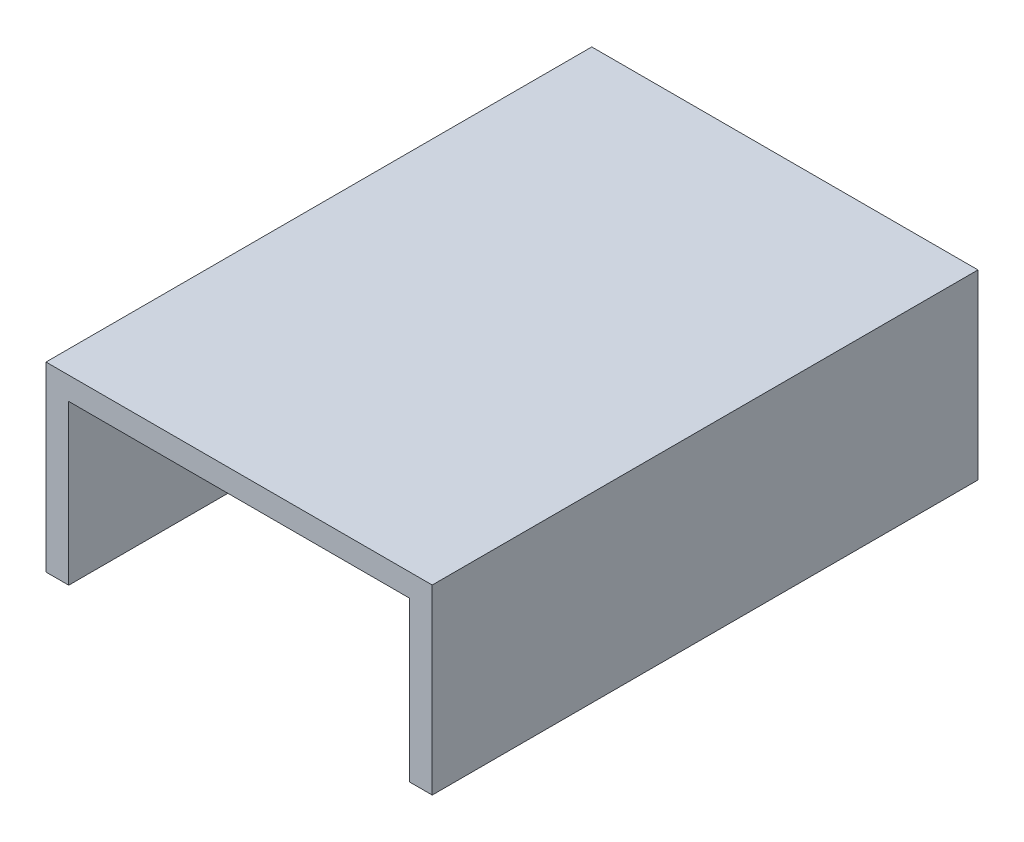
ISO-10303-21;
HEADER;
FILE_DESCRIPTION(('STEP AP214'),'2;1');
FILE_NAME('part.step','',(''),(''),'','','');
FILE_SCHEMA(('AUTOMOTIVE_DESIGN { 1 0 10303 214 1 1 1 1 }'));
ENDSEC;
DATA;
#1=APPLICATION_CONTEXT('core data for automotive mechanical design processes');
#2=APPLICATION_PROTOCOL_DEFINITION('international standard','automotive_design',2000,#1);
#3=PRODUCT_CONTEXT('',#1,'mechanical');
#4=PRODUCT('Part','Part','',(#3));
#5=PRODUCT_RELATED_PRODUCT_CATEGORY('part','',(#4));
#6=PRODUCT_DEFINITION_FORMATION('','',#4);
#7=PRODUCT_DEFINITION_CONTEXT('part definition',#1,'design');
#8=PRODUCT_DEFINITION('design','',#6,#7);
#9=PRODUCT_DEFINITION_SHAPE('','',#8);
#10=(LENGTH_UNIT() NAMED_UNIT(*) SI_UNIT(.MILLI.,.METRE.));
#11=(NAMED_UNIT(*) PLANE_ANGLE_UNIT() SI_UNIT($,.RADIAN.));
#12=(NAMED_UNIT(*) SI_UNIT($,.STERADIAN.) SOLID_ANGLE_UNIT());
#13=UNCERTAINTY_MEASURE_WITH_UNIT(LENGTH_MEASURE(1.E-05),#10,'distance_accuracy_value','');
#14=(GEOMETRIC_REPRESENTATION_CONTEXT(3) GLOBAL_UNCERTAINTY_ASSIGNED_CONTEXT((#13)) GLOBAL_UNIT_ASSIGNED_CONTEXT((#10,
#11,#12)) REPRESENTATION_CONTEXT('',''));
#15=CARTESIAN_POINT('',(0.,0.,0.));
#16=DIRECTION('',(0.,0.,1.));
#17=DIRECTION('',(1.,0.,0.));
#18=AXIS2_PLACEMENT_3D('',#15,#16,#17);
#19=CARTESIAN_POINT('',(-23.7871,-22.225,76.2));
#20=DIRECTION('',(0.,1.,0.));
#21=DIRECTION('',(-1.,0.,0.));
#22=AXIS2_PLACEMENT_3D('',#19,#20,#21);
#23=PLANE('',#22);
#24=DIRECTION('',(1.,0.,0.));
#25=VECTOR('',#24,1.);
#26=CARTESIAN_POINT('',(-23.7871,-22.225,0.));
#27=LINE('',#26,#25);
#28=CARTESIAN_POINT('',(-26.9621,-22.225,0.));
#29=VERTEX_POINT('',#28);
#30=CARTESIAN_POINT('',(-23.7871,-22.225,0.));
#31=VERTEX_POINT('',#30);
#32=EDGE_CURVE('E133',#29,#31,#27,.T.);
#33=ORIENTED_EDGE('',*,*,#32,.T.);
#34=DIRECTION('',(0.,0.,-1.));
#35=VECTOR('',#34,1.);
#36=CARTESIAN_POINT('',(-23.7871,-22.225,76.2));
#37=LINE('',#36,#35);
#38=CARTESIAN_POINT('',(-23.7871,-22.225,76.2));
#39=VERTEX_POINT('',#38);
#40=EDGE_CURVE('E11',#39,#31,#37,.T.);
#41=ORIENTED_EDGE('',*,*,#40,.F.);
#42=DIRECTION('',(1.,0.,0.));
#43=VECTOR('',#42,1.);
#44=CARTESIAN_POINT('',(-23.7871,-22.225,76.2));
#45=LINE('',#44,#43);
#46=CARTESIAN_POINT('',(-26.9621,-22.225,76.2));
#47=VERTEX_POINT('',#46);
#48=EDGE_CURVE('E147',#47,#39,#45,.T.);
#49=ORIENTED_EDGE('',*,*,#48,.F.);
#50=DIRECTION('',(0.,0.,-1.));
#51=VECTOR('',#50,1.);
#52=CARTESIAN_POINT('',(-26.9621,-22.225,76.2));
#53=LINE('',#52,#51);
#54=EDGE_CURVE('E129',#47,#29,#53,.T.);
#55=ORIENTED_EDGE('',*,*,#54,.T.);
#56=EDGE_LOOP('',(#33,#41,#49,#55));
#57=FACE_BOUND('',#56,.T.);
#58=ADVANCED_FACE('F37',(#57),#23,.F.);
#59=CARTESIAN_POINT('',(-23.7871,0.,76.2));
#60=DIRECTION('',(-1.,0.,0.));
#61=DIRECTION('',(0.,-1.,0.));
#62=AXIS2_PLACEMENT_3D('',#59,#60,#61);
#63=PLANE('',#62);
#64=DIRECTION('',(0.,1.,0.));
#65=VECTOR('',#64,1.);
#66=CARTESIAN_POINT('',(-23.7871,0.,0.));
#67=LINE('',#66,#65);
#68=CARTESIAN_POINT('',(-23.7871,0.,0.));
#69=VERTEX_POINT('',#68);
#70=EDGE_CURVE('E136',#31,#69,#67,.T.);
#71=ORIENTED_EDGE('',*,*,#70,.T.);
#72=DIRECTION('',(0.,0.,-1.));
#73=VECTOR('',#72,1.);
#74=CARTESIAN_POINT('',(-23.7871,0.,76.2));
#75=LINE('',#74,#73);
#76=CARTESIAN_POINT('',(-23.7871,0.,76.2));
#77=VERTEX_POINT('',#76);
#78=EDGE_CURVE('E45',#77,#69,#75,.T.);
#79=ORIENTED_EDGE('',*,*,#78,.F.);
#80=DIRECTION('',(0.,1.,0.));
#81=VECTOR('',#80,1.);
#82=CARTESIAN_POINT('',(-23.7871,0.,76.2));
#83=LINE('',#82,#81);
#84=EDGE_CURVE('E96',#39,#77,#83,.T.);
#85=ORIENTED_EDGE('',*,*,#84,.F.);
#86=ORIENTED_EDGE('',*,*,#40,.T.);
#87=EDGE_LOOP('',(#71,#79,#85,#86));
#88=FACE_BOUND('',#87,.T.);
#89=ADVANCED_FACE('F182',(#88),#63,.F.);
#90=CARTESIAN_POINT('',(23.7871,0.,76.2));
#91=DIRECTION('',(0.,1.,0.));
#92=DIRECTION('',(0.,0.,1.));
#93=AXIS2_PLACEMENT_3D('',#90,#91,#92);
#94=PLANE('',#93);
#95=DIRECTION('',(1.,0.,0.));
#96=VECTOR('',#95,1.);
#97=CARTESIAN_POINT('',(23.7871,0.,0.));
#98=LINE('',#97,#96);
#99=CARTESIAN_POINT('',(23.7871,0.,0.));
#100=VERTEX_POINT('',#99);
#101=EDGE_CURVE('E138',#69,#100,#98,.T.);
#102=ORIENTED_EDGE('',*,*,#101,.T.);
#103=DIRECTION('',(0.,0.,-1.));
#104=VECTOR('',#103,1.);
#105=CARTESIAN_POINT('',(23.7871,0.,76.2));
#106=LINE('',#105,#104);
#107=CARTESIAN_POINT('',(23.7871,0.,76.2));
#108=VERTEX_POINT('',#107);
#109=EDGE_CURVE('E154',#108,#100,#106,.T.);
#110=ORIENTED_EDGE('',*,*,#109,.F.);
#111=DIRECTION('',(1.,0.,0.));
#112=VECTOR('',#111,1.);
#113=CARTESIAN_POINT('',(23.7871,0.,76.2));
#114=LINE('',#113,#112);
#115=EDGE_CURVE('E162',#77,#108,#114,.T.);
#116=ORIENTED_EDGE('',*,*,#115,.F.);
#117=ORIENTED_EDGE('',*,*,#78,.T.);
#118=EDGE_LOOP('',(#102,#110,#116,#117));
#119=FACE_BOUND('',#118,.T.);
#120=ADVANCED_FACE('F160',(#119),#94,.F.);
#121=CARTESIAN_POINT('',(23.7871,-22.225,76.2));
#122=DIRECTION('',(1.,0.,0.));
#123=DIRECTION('',(0.,1.,0.));
#124=AXIS2_PLACEMENT_3D('',#121,#122,#123);
#125=PLANE('',#124);
#126=DIRECTION('',(0.,-1.,0.));
#127=VECTOR('',#126,1.);
#128=CARTESIAN_POINT('',(23.7871,-22.225,0.));
#129=LINE('',#128,#127);
#130=CARTESIAN_POINT('',(23.7871,-22.225,0.));
#131=VERTEX_POINT('',#130);
#132=EDGE_CURVE('E140',#100,#131,#129,.T.);
#133=ORIENTED_EDGE('',*,*,#132,.T.);
#134=DIRECTION('',(0.,0.,-1.));
#135=VECTOR('',#134,1.);
#136=CARTESIAN_POINT('',(23.7871,-22.225,76.2));
#137=LINE('',#136,#135);
#138=CARTESIAN_POINT('',(23.7871,-22.225,76.2));
#139=VERTEX_POINT('',#138);
#140=EDGE_CURVE('E151',#139,#131,#137,.T.);
#141=ORIENTED_EDGE('',*,*,#140,.F.);
#142=DIRECTION('',(0.,-1.,0.));
#143=VECTOR('',#142,1.);
#144=CARTESIAN_POINT('',(23.7871,-22.225,76.2));
#145=LINE('',#144,#143);
#146=EDGE_CURVE('E174',#108,#139,#145,.T.);
#147=ORIENTED_EDGE('',*,*,#146,.F.);
#148=ORIENTED_EDGE('',*,*,#109,.T.);
#149=EDGE_LOOP('',(#133,#141,#147,#148));
#150=FACE_BOUND('',#149,.T.);
#151=ADVANCED_FACE('F170',(#150),#125,.F.);
#152=CARTESIAN_POINT('',(26.9621,-22.225,76.2));
#153=DIRECTION('',(0.,1.,0.));
#154=DIRECTION('',(-1.,0.,0.));
#155=AXIS2_PLACEMENT_3D('',#152,#153,#154);
#156=PLANE('',#155);
#157=DIRECTION('',(1.,0.,0.));
#158=VECTOR('',#157,1.);
#159=CARTESIAN_POINT('',(26.9621,-22.225,0.));
#160=LINE('',#159,#158);
#161=CARTESIAN_POINT('',(26.9621,-22.225,0.));
#162=VERTEX_POINT('',#161);
#163=EDGE_CURVE('E142',#131,#162,#160,.T.);
#164=ORIENTED_EDGE('',*,*,#163,.T.);
#165=DIRECTION('',(0.,0.,-1.));
#166=VECTOR('',#165,1.);
#167=CARTESIAN_POINT('',(26.9621,-22.225,76.2));
#168=LINE('',#167,#166);
#169=CARTESIAN_POINT('',(26.9621,-22.225,76.2));
#170=VERTEX_POINT('',#169);
#171=EDGE_CURVE('E124',#170,#162,#168,.T.);
#172=ORIENTED_EDGE('',*,*,#171,.F.);
#173=DIRECTION('',(1.,0.,0.));
#174=VECTOR('',#173,1.);
#175=CARTESIAN_POINT('',(26.9621,-22.225,76.2));
#176=LINE('',#175,#174);
#177=EDGE_CURVE('E115',#139,#170,#176,.T.);
#178=ORIENTED_EDGE('',*,*,#177,.F.);
#179=ORIENTED_EDGE('',*,*,#140,.T.);
#180=EDGE_LOOP('',(#164,#172,#178,#179));
#181=FACE_BOUND('',#180,.T.);
#182=ADVANCED_FACE('F173',(#181),#156,.F.);
#183=CARTESIAN_POINT('',(26.9621,3.17499999999999,76.2));
#184=DIRECTION('',(-1.,0.,0.));
#185=DIRECTION('',(0.,-1.,0.));
#186=AXIS2_PLACEMENT_3D('',#183,#184,#185);
#187=PLANE('',#186);
#188=DIRECTION('',(0.,1.,0.));
#189=VECTOR('',#188,1.);
#190=CARTESIAN_POINT('',(26.9621,3.17499999999999,0.));
#191=LINE('',#190,#189);
#192=CARTESIAN_POINT('',(26.9621,3.17499999999999,0.));
#193=VERTEX_POINT('',#192);
#194=EDGE_CURVE('E123',#162,#193,#191,.T.);
#195=ORIENTED_EDGE('',*,*,#194,.T.);
#196=DIRECTION('',(0.,0.,-1.));
#197=VECTOR('',#196,1.);
#198=CARTESIAN_POINT('',(26.9621,3.17499999999999,76.2));
#199=LINE('',#198,#197);
#200=CARTESIAN_POINT('',(26.9621,3.17499999999999,76.2));
#201=VERTEX_POINT('',#200);
#202=EDGE_CURVE('E120',#201,#193,#199,.T.);
#203=ORIENTED_EDGE('',*,*,#202,.F.);
#204=DIRECTION('',(0.,1.,0.));
#205=VECTOR('',#204,1.);
#206=CARTESIAN_POINT('',(26.9621,3.17499999999999,76.2));
#207=LINE('',#206,#205);
#208=EDGE_CURVE('E109',#170,#201,#207,.T.);
#209=ORIENTED_EDGE('',*,*,#208,.F.);
#210=ORIENTED_EDGE('',*,*,#171,.T.);
#211=EDGE_LOOP('',(#195,#203,#209,#210));
#212=FACE_BOUND('',#211,.T.);
#213=ADVANCED_FACE('F121',(#212),#187,.F.);
#214=CARTESIAN_POINT('',(-26.9621,3.17499999999999,76.2));
#215=DIRECTION('',(0.,-1.,0.));
#216=DIRECTION('',(0.,0.,-1.));
#217=AXIS2_PLACEMENT_3D('',#214,#215,#216);
#218=PLANE('',#217);
#219=DIRECTION('',(-1.,0.,0.));
#220=VECTOR('',#219,1.);
#221=CARTESIAN_POINT('',(-26.9621,3.17499999999999,0.));
#222=LINE('',#221,#220);
#223=CARTESIAN_POINT('',(-26.9621,3.17499999999999,0.));
#224=VERTEX_POINT('',#223);
#225=EDGE_CURVE('E82',#193,#224,#222,.T.);
#226=ORIENTED_EDGE('',*,*,#225,.T.);
#227=DIRECTION('',(0.,0.,-1.));
#228=VECTOR('',#227,1.);
#229=CARTESIAN_POINT('',(-26.9621,3.17499999999999,76.2));
#230=LINE('',#229,#228);
#231=CARTESIAN_POINT('',(-26.9621,3.17499999999999,76.2));
#232=VERTEX_POINT('',#231);
#233=EDGE_CURVE('E125',#232,#224,#230,.T.);
#234=ORIENTED_EDGE('',*,*,#233,.F.);
#235=DIRECTION('',(-1.,0.,0.));
#236=VECTOR('',#235,1.);
#237=CARTESIAN_POINT('',(-26.9621,3.17499999999999,76.2));
#238=LINE('',#237,#236);
#239=EDGE_CURVE('E113',#201,#232,#238,.T.);
#240=ORIENTED_EDGE('',*,*,#239,.F.);
#241=ORIENTED_EDGE('',*,*,#202,.T.);
#242=EDGE_LOOP('',(#226,#234,#240,#241));
#243=FACE_BOUND('',#242,.T.);
#244=ADVANCED_FACE('F127',(#243),#218,.F.);
#245=CARTESIAN_POINT('',(-26.9621,-22.225,76.2));
#246=DIRECTION('',(1.,0.,0.));
#247=DIRECTION('',(0.,1.,0.));
#248=AXIS2_PLACEMENT_3D('',#245,#246,#247);
#249=PLANE('',#248);
#250=DIRECTION('',(0.,-1.,0.));
#251=VECTOR('',#250,1.);
#252=CARTESIAN_POINT('',(-26.9621,-22.225,0.));
#253=LINE('',#252,#251);
#254=EDGE_CURVE('E88',#224,#29,#253,.T.);
#255=ORIENTED_EDGE('',*,*,#254,.T.);
#256=ORIENTED_EDGE('',*,*,#54,.F.);
#257=DIRECTION('',(0.,-1.,0.));
#258=VECTOR('',#257,1.);
#259=CARTESIAN_POINT('',(-26.9621,-22.225,76.2));
#260=LINE('',#259,#258);
#261=EDGE_CURVE('E53',#232,#47,#260,.T.);
#262=ORIENTED_EDGE('',*,*,#261,.F.);
#263=ORIENTED_EDGE('',*,*,#233,.T.);
#264=EDGE_LOOP('',(#255,#256,#262,#263));
#265=FACE_BOUND('',#264,.T.);
#266=ADVANCED_FACE('F198',(#265),#249,.F.);
#267=CARTESIAN_POINT('',(0.,0.,76.2));
#268=DIRECTION('',(0.,0.,-1.));
#269=DIRECTION('',(-1.,0.,0.));
#270=AXIS2_PLACEMENT_3D('',#267,#268,#269);
#271=PLANE('',#270);
#272=ORIENTED_EDGE('',*,*,#48,.T.);
#273=ORIENTED_EDGE('',*,*,#84,.T.);
#274=ORIENTED_EDGE('',*,*,#115,.T.);
#275=ORIENTED_EDGE('',*,*,#146,.T.);
#276=ORIENTED_EDGE('',*,*,#177,.T.);
#277=ORIENTED_EDGE('',*,*,#208,.T.);
#278=ORIENTED_EDGE('',*,*,#239,.T.);
#279=ORIENTED_EDGE('',*,*,#261,.T.);
#280=EDGE_LOOP('',(#272,#273,#274,#275,#276,#277,#278,#279));
#281=FACE_BOUND('',#280,.T.);
#282=ADVANCED_FACE('F111',(#281),#271,.F.);
#283=CARTESIAN_POINT('',(0.,0.,0.));
#284=DIRECTION('',(0.,0.,-1.));
#285=DIRECTION('',(-1.,0.,0.));
#286=AXIS2_PLACEMENT_3D('',#283,#284,#285);
#287=PLANE('',#286);
#288=ORIENTED_EDGE('',*,*,#32,.F.);
#289=ORIENTED_EDGE('',*,*,#254,.F.);
#290=ORIENTED_EDGE('',*,*,#225,.F.);
#291=ORIENTED_EDGE('',*,*,#194,.F.);
#292=ORIENTED_EDGE('',*,*,#163,.F.);
#293=ORIENTED_EDGE('',*,*,#132,.F.);
#294=ORIENTED_EDGE('',*,*,#101,.F.);
#295=ORIENTED_EDGE('',*,*,#70,.F.);
#296=EDGE_LOOP('',(#288,#289,#290,#291,#292,#293,#294,#295));
#297=FACE_BOUND('',#296,.T.);
#298=ADVANCED_FACE('F166',(#297),#287,.T.);
#299=CLOSED_SHELL('',(#58,#89,#120,#151,#182,#213,#244,#266,#282,#298));
#300=MANIFOLD_SOLID_BREP('B2',#299);
#301=ADVANCED_BREP_SHAPE_REPRESENTATION('',(#18,#300),#14);
#302=SHAPE_DEFINITION_REPRESENTATION(#9,#301);
ENDSEC;
END-ISO-10303-21;
